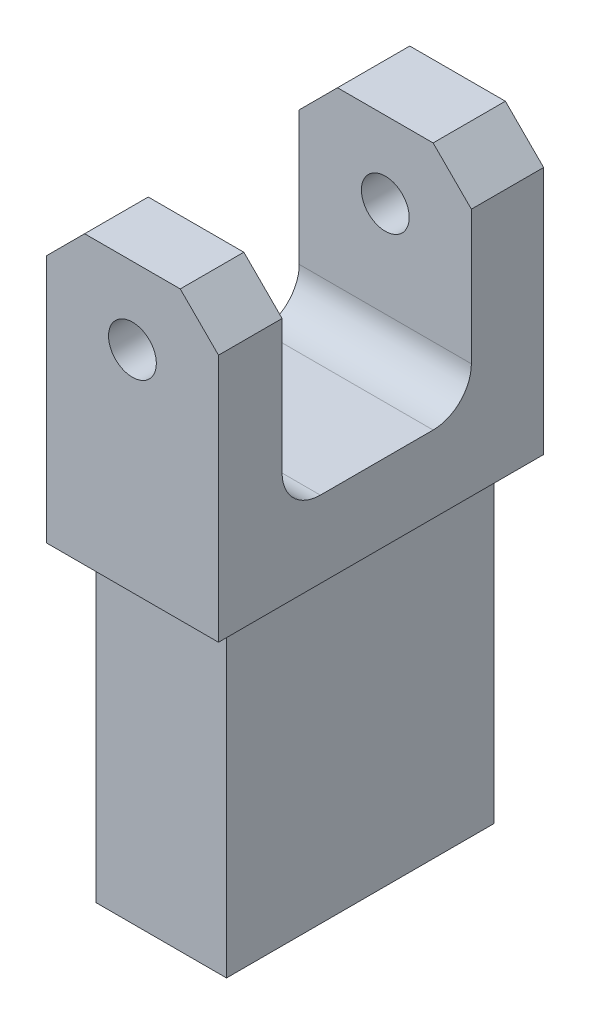
ISO-10303-21;
HEADER;
FILE_DESCRIPTION(('STEP AP214'),'2;1');
FILE_NAME('part.step','',(''),(''),'','','');
FILE_SCHEMA(('AUTOMOTIVE_DESIGN { 1 0 10303 214 1 1 1 1 }'));
ENDSEC;
DATA;
#1=APPLICATION_CONTEXT('core data for automotive mechanical design processes');
#2=APPLICATION_PROTOCOL_DEFINITION('international standard','automotive_design',2000,#1);
#3=PRODUCT_CONTEXT('',#1,'mechanical');
#4=PRODUCT('Part','Part','',(#3));
#5=PRODUCT_RELATED_PRODUCT_CATEGORY('part','',(#4));
#6=PRODUCT_DEFINITION_FORMATION('','',#4);
#7=PRODUCT_DEFINITION_CONTEXT('part definition',#1,'design');
#8=PRODUCT_DEFINITION('design','',#6,#7);
#9=PRODUCT_DEFINITION_SHAPE('','',#8);
#10=(LENGTH_UNIT() NAMED_UNIT(*) SI_UNIT(.MILLI.,.METRE.));
#11=(NAMED_UNIT(*) PLANE_ANGLE_UNIT() SI_UNIT($,.RADIAN.));
#12=(NAMED_UNIT(*) SI_UNIT($,.STERADIAN.) SOLID_ANGLE_UNIT());
#13=UNCERTAINTY_MEASURE_WITH_UNIT(LENGTH_MEASURE(1.E-05),#10,'distance_accuracy_value','');
#14=(GEOMETRIC_REPRESENTATION_CONTEXT(3) GLOBAL_UNCERTAINTY_ASSIGNED_CONTEXT((#13)) GLOBAL_UNIT_ASSIGNED_CONTEXT((#10,
#11,#12)) REPRESENTATION_CONTEXT('',''));
#15=CARTESIAN_POINT('',(0.,0.,0.));
#16=DIRECTION('',(0.,0.,1.));
#17=DIRECTION('',(1.,0.,0.));
#18=AXIS2_PLACEMENT_3D('',#15,#16,#17);
#19=CARTESIAN_POINT('',(-0.577831778362566,45.,19.6101717655523));
#20=DIRECTION('',(0.,1.,0.));
#21=DIRECTION('',(0.,0.,1.));
#22=AXIS2_PLACEMENT_3D('',#19,#20,#21);
#23=PLANE('',#22);
#24=DIRECTION('',(-1.,0.,0.));
#25=VECTOR('',#24,1.);
#26=CARTESIAN_POINT('',(-0.577831778362566,45.,27.1665188383849));
#27=LINE('',#26,#25);
#28=CARTESIAN_POINT('',(13.4221682216374,45.,27.1665188383849));
#29=VERTEX_POINT('',#28);
#30=CARTESIAN_POINT('',(3.42216822163744,45.,27.1665188383849));
#31=VERTEX_POINT('',#30);
#32=EDGE_CURVE('E233',#29,#31,#27,.T.);
#33=ORIENTED_EDGE('',*,*,#32,.F.);
#34=DIRECTION('',(0.,0.,-1.));
#35=VECTOR('',#34,1.);
#36=CARTESIAN_POINT('',(13.4221682216374,45.,19.6101717655523));
#37=LINE('',#36,#35);
#38=CARTESIAN_POINT('',(13.4221682216374,45.,19.6101717655523));
#39=VERTEX_POINT('',#38);
#40=EDGE_CURVE('E283',#29,#39,#37,.T.);
#41=ORIENTED_EDGE('',*,*,#40,.T.);
#42=DIRECTION('',(-1.,0.,0.));
#43=VECTOR('',#42,1.);
#44=CARTESIAN_POINT('',(17.4221682216374,45.,19.6101717655523));
#45=LINE('',#44,#43);
#46=CARTESIAN_POINT('',(3.42216822163743,45.,19.6101717655523));
#47=VERTEX_POINT('',#46);
#48=EDGE_CURVE('E187',#39,#47,#45,.T.);
#49=ORIENTED_EDGE('',*,*,#48,.T.);
#50=DIRECTION('',(0.,0.,1.));
#51=VECTOR('',#50,1.);
#52=CARTESIAN_POINT('',(3.42216822163744,45.,27.1665188383849));
#53=LINE('',#52,#51);
#54=EDGE_CURVE('E280',#47,#31,#53,.T.);
#55=ORIENTED_EDGE('',*,*,#54,.T.);
#56=EDGE_LOOP('',(#33,#41,#49,#55));
#57=FACE_BOUND('',#56,.T.);
#58=ADVANCED_FACE('F32',(#57),#23,.T.);
#59=CARTESIAN_POINT('',(1.59801074958471,15.,22.624129945896));
#60=DIRECTION('',(1.,0.,0.));
#61=DIRECTION('',(0.,0.,-1.));
#62=AXIS2_PLACEMENT_3D('',#59,#60,#61);
#63=PLANE('',#62);
#64=DIRECTION('',(0.,0.,1.));
#65=VECTOR('',#64,1.);
#66=CARTESIAN_POINT('',(1.59801074958471,-18.,22.624129945896));
#67=LINE('',#66,#65);
#68=CARTESIAN_POINT('',(1.59801074958471,-18.,22.624129945896));
#69=VERTEX_POINT('',#68);
#70=CARTESIAN_POINT('',(1.59801074958471,-18.,50.5962135852226));
#71=VERTEX_POINT('',#70);
#72=EDGE_CURVE('E166',#69,#71,#67,.T.);
#73=ORIENTED_EDGE('',*,*,#72,.T.);
#74=DIRECTION('',(0.,-1.,0.));
#75=VECTOR('',#74,1.);
#76=CARTESIAN_POINT('',(1.59801074958471,15.,50.5962135852226));
#77=LINE('',#76,#75);
#78=CARTESIAN_POINT('',(1.59801074958471,15.,50.5962135852226));
#79=VERTEX_POINT('',#78);
#80=EDGE_CURVE('E227',#79,#71,#77,.T.);
#81=ORIENTED_EDGE('',*,*,#80,.F.);
#82=DIRECTION('',(0.,0.,1.));
#83=VECTOR('',#82,1.);
#84=CARTESIAN_POINT('',(1.59801074958471,15.,22.624129945896));
#85=LINE('',#84,#83);
#86=CARTESIAN_POINT('',(1.59801074958471,15.,22.624129945896));
#87=VERTEX_POINT('',#86);
#88=EDGE_CURVE('E198',#87,#79,#85,.T.);
#89=ORIENTED_EDGE('',*,*,#88,.F.);
#90=DIRECTION('',(0.,-1.,0.));
#91=VECTOR('',#90,1.);
#92=CARTESIAN_POINT('',(1.59801074958471,15.,22.624129945896));
#93=LINE('',#92,#91);
#94=EDGE_CURVE('E211',#87,#69,#93,.T.);
#95=ORIENTED_EDGE('',*,*,#94,.T.);
#96=EDGE_LOOP('',(#73,#81,#89,#95));
#97=FACE_BOUND('',#96,.T.);
#98=ADVANCED_FACE('F320',(#97),#63,.F.);
#99=CARTESIAN_POINT('',(1.59801074958471,15.,50.5962135852226));
#100=DIRECTION('',(0.,0.,-1.));
#101=DIRECTION('',(-1.,0.,0.));
#102=AXIS2_PLACEMENT_3D('',#99,#100,#101);
#103=PLANE('',#102);
#104=DIRECTION('',(1.,0.,0.));
#105=VECTOR('',#104,1.);
#106=CARTESIAN_POINT('',(1.59801074958471,-18.,50.5962135852226));
#107=LINE('',#106,#105);
#108=CARTESIAN_POINT('',(15.2463256936804,-18.,50.5962135852226));
#109=VERTEX_POINT('',#108);
#110=EDGE_CURVE('E214',#71,#109,#107,.T.);
#111=ORIENTED_EDGE('',*,*,#110,.T.);
#112=DIRECTION('',(0.,-1.,0.));
#113=VECTOR('',#112,1.);
#114=CARTESIAN_POINT('',(15.2463256936804,15.,50.5962135852226));
#115=LINE('',#114,#113);
#116=CARTESIAN_POINT('',(15.2463256936804,15.,50.5962135852226));
#117=VERTEX_POINT('',#116);
#118=EDGE_CURVE('E224',#117,#109,#115,.T.);
#119=ORIENTED_EDGE('',*,*,#118,.F.);
#120=DIRECTION('',(1.,0.,0.));
#121=VECTOR('',#120,1.);
#122=CARTESIAN_POINT('',(1.59801074958471,15.,50.5962135852226));
#123=LINE('',#122,#121);
#124=EDGE_CURVE('E201',#79,#117,#123,.T.);
#125=ORIENTED_EDGE('',*,*,#124,.F.);
#126=ORIENTED_EDGE('',*,*,#80,.T.);
#127=EDGE_LOOP('',(#111,#119,#125,#126));
#128=FACE_BOUND('',#127,.T.);
#129=ADVANCED_FACE('F326',(#128),#103,.F.);
#130=CARTESIAN_POINT('',(15.2463256936804,15.,22.624129945896));
#131=DIRECTION('',(-1.,0.,0.));
#132=DIRECTION('',(0.,0.,1.));
#133=AXIS2_PLACEMENT_3D('',#130,#131,#132);
#134=PLANE('',#133);
#135=DIRECTION('',(0.,0.,-1.));
#136=VECTOR('',#135,1.);
#137=CARTESIAN_POINT('',(15.2463256936804,-18.,22.624129945896));
#138=LINE('',#137,#136);
#139=CARTESIAN_POINT('',(15.2463256936804,-18.,22.624129945896));
#140=VERTEX_POINT('',#139);
#141=EDGE_CURVE('E216',#109,#140,#138,.T.);
#142=ORIENTED_EDGE('',*,*,#141,.T.);
#143=DIRECTION('',(0.,-1.,0.));
#144=VECTOR('',#143,1.);
#145=CARTESIAN_POINT('',(15.2463256936804,15.,22.624129945896));
#146=LINE('',#145,#144);
#147=CARTESIAN_POINT('',(15.2463256936804,15.,22.624129945896));
#148=VERTEX_POINT('',#147);
#149=EDGE_CURVE('E221',#148,#140,#146,.T.);
#150=ORIENTED_EDGE('',*,*,#149,.F.);
#151=DIRECTION('',(0.,0.,-1.));
#152=VECTOR('',#151,1.);
#153=CARTESIAN_POINT('',(15.2463256936804,15.,22.624129945896));
#154=LINE('',#153,#152);
#155=EDGE_CURVE('E205',#117,#148,#154,.T.);
#156=ORIENTED_EDGE('',*,*,#155,.F.);
#157=ORIENTED_EDGE('',*,*,#118,.T.);
#158=EDGE_LOOP('',(#142,#150,#156,#157));
#159=FACE_BOUND('',#158,.T.);
#160=ADVANCED_FACE('F512',(#159),#134,.F.);
#161=CARTESIAN_POINT('',(1.59801074958471,15.,22.624129945896));
#162=DIRECTION('',(0.,0.,1.));
#163=DIRECTION('',(1.,0.,0.));
#164=AXIS2_PLACEMENT_3D('',#161,#162,#163);
#165=PLANE('',#164);
#166=DIRECTION('',(-1.,0.,0.));
#167=VECTOR('',#166,1.);
#168=CARTESIAN_POINT('',(1.59801074958471,-18.,22.624129945896));
#169=LINE('',#168,#167);
#170=EDGE_CURVE('E202',#140,#69,#169,.T.);
#171=ORIENTED_EDGE('',*,*,#170,.T.);
#172=ORIENTED_EDGE('',*,*,#94,.F.);
#173=DIRECTION('',(-1.,0.,0.));
#174=VECTOR('',#173,1.);
#175=CARTESIAN_POINT('',(1.59801074958471,15.,22.624129945896));
#176=LINE('',#175,#174);
#177=EDGE_CURVE('E208',#148,#87,#176,.T.);
#178=ORIENTED_EDGE('',*,*,#177,.F.);
#179=ORIENTED_EDGE('',*,*,#149,.T.);
#180=EDGE_LOOP('',(#171,#172,#178,#179));
#181=FACE_BOUND('',#180,.T.);
#182=ADVANCED_FACE('F503',(#181),#165,.F.);
#183=CARTESIAN_POINT('',(1.59801074958471,-18.,50.5962135852226));
#184=DIRECTION('',(0.,1.,0.));
#185=DIRECTION('',(0.,0.,1.));
#186=AXIS2_PLACEMENT_3D('',#183,#184,#185);
#187=PLANE('',#186);
#188=ORIENTED_EDGE('',*,*,#72,.F.);
#189=ORIENTED_EDGE('',*,*,#170,.F.);
#190=ORIENTED_EDGE('',*,*,#141,.F.);
#191=ORIENTED_EDGE('',*,*,#110,.F.);
#192=EDGE_LOOP('',(#188,#189,#190,#191));
#193=FACE_BOUND('',#192,.T.);
#194=ADVANCED_FACE('F495',(#193),#187,.F.);
#195=CARTESIAN_POINT('',(-0.577831778362566,15.,19.6101717655523));
#196=DIRECTION('',(0.,1.,0.));
#197=DIRECTION('',(0.,0.,1.));
#198=AXIS2_PLACEMENT_3D('',#195,#196,#197);
#199=PLANE('',#198);
#200=DIRECTION('',(0.,0.,1.));
#201=VECTOR('',#200,1.);
#202=CARTESIAN_POINT('',(-0.577831778362568,15.,53.6101717655523));
#203=LINE('',#202,#201);
#204=CARTESIAN_POINT('',(-0.577831778362568,15.,19.6101717655523));
#205=VERTEX_POINT('',#204);
#206=CARTESIAN_POINT('',(-0.577831778362568,15.,53.6101717655523));
#207=VERTEX_POINT('',#206);
#208=EDGE_CURVE('E174',#205,#207,#203,.T.);
#209=ORIENTED_EDGE('',*,*,#208,.F.);
#210=DIRECTION('',(-1.,0.,0.));
#211=VECTOR('',#210,1.);
#212=CARTESIAN_POINT('',(17.4221682216374,15.,19.6101717655523));
#213=LINE('',#212,#211);
#214=CARTESIAN_POINT('',(17.4221682216374,15.,19.6101717655523));
#215=VERTEX_POINT('',#214);
#216=EDGE_CURVE('E191',#215,#205,#213,.T.);
#217=ORIENTED_EDGE('',*,*,#216,.F.);
#218=DIRECTION('',(0.,0.,-1.));
#219=VECTOR('',#218,1.);
#220=CARTESIAN_POINT('',(17.4221682216374,15.,53.6101717655523));
#221=LINE('',#220,#219);
#222=CARTESIAN_POINT('',(17.4221682216374,15.,53.6101717655523));
#223=VERTEX_POINT('',#222);
#224=EDGE_CURVE('E176',#223,#215,#221,.T.);
#225=ORIENTED_EDGE('',*,*,#224,.F.);
#226=DIRECTION('',(1.,0.,0.));
#227=VECTOR('',#226,1.);
#228=CARTESIAN_POINT('',(17.4221682216374,15.,53.6101717655523));
#229=LINE('',#228,#227);
#230=EDGE_CURVE('E160',#207,#223,#229,.T.);
#231=ORIENTED_EDGE('',*,*,#230,.F.);
#232=EDGE_LOOP('',(#209,#217,#225,#231));
#233=FACE_BOUND('',#232,.T.);
#234=ORIENTED_EDGE('',*,*,#177,.T.);
#235=ORIENTED_EDGE('',*,*,#88,.T.);
#236=ORIENTED_EDGE('',*,*,#124,.T.);
#237=ORIENTED_EDGE('',*,*,#155,.T.);
#238=EDGE_LOOP('',(#234,#235,#236,#237));
#239=FACE_BOUND('',#238,.T.);
#240=ADVANCED_FACE('F171',(#233,#239),#199,.F.);
#241=CARTESIAN_POINT('',(-0.577831778362568,45.,53.6101717655523));
#242=DIRECTION('',(1.,0.,0.));
#243=DIRECTION('',(0.,0.,-1.));
#244=AXIS2_PLACEMENT_3D('',#241,#242,#243);
#245=PLANE('',#244);
#246=DIRECTION('',(0.,-1.,0.));
#247=VECTOR('',#246,1.);
#248=CARTESIAN_POINT('',(-0.577831778362568,45.,53.6101717655523));
#249=LINE('',#248,#247);
#250=CARTESIAN_POINT('',(-0.577831778362568,41.,53.6101717655523));
#251=VERTEX_POINT('',#250);
#252=EDGE_CURVE('E156',#251,#207,#249,.T.);
#253=ORIENTED_EDGE('',*,*,#252,.F.);
#254=DIRECTION('',(0.,0.,-1.));
#255=VECTOR('',#254,1.);
#256=CARTESIAN_POINT('',(-0.577831778362568,41.,46.9592331897388));
#257=LINE('',#256,#255);
#258=CARTESIAN_POINT('',(-0.577831778362568,41.,46.9592331897388));
#259=VERTEX_POINT('',#258);
#260=EDGE_CURVE('E11',#251,#259,#257,.T.);
#261=ORIENTED_EDGE('',*,*,#260,.T.);
#262=DIRECTION('',(0.,-1.,0.));
#263=VECTOR('',#262,1.);
#264=CARTESIAN_POINT('',(-0.577831778362568,45.,46.9592331897388));
#265=LINE('',#264,#263);
#266=CARTESIAN_POINT('',(-0.577831778362568,27.,46.9592331897388));
#267=VERTEX_POINT('',#266);
#268=EDGE_CURVE('E355',#259,#267,#265,.T.);
#269=ORIENTED_EDGE('',*,*,#268,.T.);
#270=CARTESIAN_POINT('',(-0.577831778362568,27.,42.9592331897388));
#271=DIRECTION('',(1.,0.,0.));
#272=DIRECTION('',(0.,0.,-1.));
#273=AXIS2_PLACEMENT_3D('',#270,#271,#272);
#274=CIRCLE('',#273,4.);
#275=CARTESIAN_POINT('',(-0.577831778362568,23.,42.9592331897388));
#276=VERTEX_POINT('',#275);
#277=EDGE_CURVE('E256',#267,#276,#274,.T.);
#278=ORIENTED_EDGE('',*,*,#277,.T.);
#279=DIRECTION('',(0.,0.,-1.));
#280=VECTOR('',#279,1.);
#281=CARTESIAN_POINT('',(-0.577831778362568,23.,53.6101717655523));
#282=LINE('',#281,#280);
#283=CARTESIAN_POINT('',(-0.577831778362568,23.,31.1665188383849));
#284=VERTEX_POINT('',#283);
#285=EDGE_CURVE('E181',#276,#284,#282,.T.);
#286=ORIENTED_EDGE('',*,*,#285,.T.);
#287=CARTESIAN_POINT('',(-0.577831778362568,27.,31.1665188383849));
#288=DIRECTION('',(1.,0.,0.));
#289=DIRECTION('',(0.,0.,-1.));
#290=AXIS2_PLACEMENT_3D('',#287,#288,#289);
#291=CIRCLE('',#290,4.);
#292=CARTESIAN_POINT('',(-0.577831778362568,27.,27.1665188383849));
#293=VERTEX_POINT('',#292);
#294=EDGE_CURVE('E250',#284,#293,#291,.T.);
#295=ORIENTED_EDGE('',*,*,#294,.T.);
#296=DIRECTION('',(0.,1.,0.));
#297=VECTOR('',#296,1.);
#298=CARTESIAN_POINT('',(-0.577831778362568,45.,27.1665188383849));
#299=LINE('',#298,#297);
#300=CARTESIAN_POINT('',(-0.577831778362568,41.,27.1665188383849));
#301=VERTEX_POINT('',#300);
#302=EDGE_CURVE('E184',#293,#301,#299,.T.);
#303=ORIENTED_EDGE('',*,*,#302,.T.);
#304=DIRECTION('',(0.,0.,-1.));
#305=VECTOR('',#304,1.);
#306=CARTESIAN_POINT('',(-0.577831778362568,41.,19.6101717655523));
#307=LINE('',#306,#305);
#308=CARTESIAN_POINT('',(-0.577831778362568,41.,19.6101717655523));
#309=VERTEX_POINT('',#308);
#310=EDGE_CURVE('E40',#301,#309,#307,.T.);
#311=ORIENTED_EDGE('',*,*,#310,.T.);
#312=DIRECTION('',(0.,-1.,0.));
#313=VECTOR('',#312,1.);
#314=CARTESIAN_POINT('',(-0.577831778362568,45.,19.6101717655523));
#315=LINE('',#314,#313);
#316=EDGE_CURVE('E179',#309,#205,#315,.T.);
#317=ORIENTED_EDGE('',*,*,#316,.T.);
#318=ORIENTED_EDGE('',*,*,#208,.T.);
#319=EDGE_LOOP('',(#253,#261,#269,#278,#286,#295,#303,#311,#317,#318));
#320=FACE_BOUND('',#319,.T.);
#321=ADVANCED_FACE('F178',(#320),#245,.F.);
#322=CARTESIAN_POINT('',(17.4221682216374,45.,53.6101717655523));
#323=DIRECTION('',(0.,0.,-1.));
#324=DIRECTION('',(-1.,0.,0.));
#325=AXIS2_PLACEMENT_3D('',#322,#323,#324);
#326=PLANE('',#325);
#327=CARTESIAN_POINT('',(8.42216822163744,37.,53.6101717655523));
#328=DIRECTION('',(0.,0.,1.));
#329=DIRECTION('',(1.,0.,0.));
#330=AXIS2_PLACEMENT_3D('',#327,#328,#329);
#331=CIRCLE('',#330,2.5);
#332=CARTESIAN_POINT('',(10.9221682216374,37.,53.6101717655523));
#333=VERTEX_POINT('',#332);
#334=EDGE_CURVE('E554',#333,#333,#331,.T.);
#335=ORIENTED_EDGE('',*,*,#334,.F.);
#336=EDGE_LOOP('',(#335));
#337=FACE_BOUND('',#336,.T.);
#338=DIRECTION('',(0.,-1.,0.));
#339=VECTOR('',#338,1.);
#340=CARTESIAN_POINT('',(17.4221682216374,45.,53.6101717655523));
#341=LINE('',#340,#339);
#342=CARTESIAN_POINT('',(17.4221682216374,41.,53.6101717655523));
#343=VERTEX_POINT('',#342);
#344=EDGE_CURVE('E167',#343,#223,#341,.T.);
#345=ORIENTED_EDGE('',*,*,#344,.F.);
#346=DIRECTION('',(-0.707106781186546,0.707106781186549,0.));
#347=VECTOR('',#346,1.);
#348=CARTESIAN_POINT('',(13.4221682216374,45.,53.6101717655523));
#349=LINE('',#348,#347);
#350=CARTESIAN_POINT('',(13.4221682216374,45.,53.6101717655523));
#351=VERTEX_POINT('',#350);
#352=EDGE_CURVE('E278',#343,#351,#349,.T.);
#353=ORIENTED_EDGE('',*,*,#352,.T.);
#354=DIRECTION('',(1.,0.,0.));
#355=VECTOR('',#354,1.);
#356=CARTESIAN_POINT('',(17.4221682216374,45.,53.6101717655523));
#357=LINE('',#356,#355);
#358=CARTESIAN_POINT('',(3.42216822163743,45.,53.6101717655523));
#359=VERTEX_POINT('',#358);
#360=EDGE_CURVE('E193',#359,#351,#357,.T.);
#361=ORIENTED_EDGE('',*,*,#360,.F.);
#362=DIRECTION('',(-0.707106781186547,-0.707106781186548,0.));
#363=VECTOR('',#362,1.);
#364=CARTESIAN_POINT('',(3.42216822163744,45.,53.6101717655523));
#365=LINE('',#364,#363);
#366=EDGE_CURVE('E163',#359,#251,#365,.T.);
#367=ORIENTED_EDGE('',*,*,#366,.T.);
#368=ORIENTED_EDGE('',*,*,#252,.T.);
#369=ORIENTED_EDGE('',*,*,#230,.T.);
#370=EDGE_LOOP('',(#345,#353,#361,#367,#368,#369));
#371=FACE_BOUND('',#370,.T.);
#372=ADVANCED_FACE('F159',(#337,#371),#326,.F.);
#373=CARTESIAN_POINT('',(17.4221682216374,45.,53.6101717655523));
#374=DIRECTION('',(-1.,0.,0.));
#375=DIRECTION('',(0.,0.,1.));
#376=AXIS2_PLACEMENT_3D('',#373,#374,#375);
#377=PLANE('',#376);
#378=DIRECTION('',(0.,1.,0.));
#379=VECTOR('',#378,1.);
#380=CARTESIAN_POINT('',(17.4221682216374,45.,46.9592331897388));
#381=LINE('',#380,#379);
#382=CARTESIAN_POINT('',(17.4221682216374,27.,46.9592331897388));
#383=VERTEX_POINT('',#382);
#384=CARTESIAN_POINT('',(17.4221682216374,41.,46.9592331897388));
#385=VERTEX_POINT('',#384);
#386=EDGE_CURVE('E353',#383,#385,#381,.T.);
#387=ORIENTED_EDGE('',*,*,#386,.T.);
#388=DIRECTION('',(0.,0.,1.));
#389=VECTOR('',#388,1.);
#390=CARTESIAN_POINT('',(17.4221682216374,41.,53.6101717655523));
#391=LINE('',#390,#389);
#392=EDGE_CURVE('E275',#385,#343,#391,.T.);
#393=ORIENTED_EDGE('',*,*,#392,.T.);
#394=ORIENTED_EDGE('',*,*,#344,.T.);
#395=ORIENTED_EDGE('',*,*,#224,.T.);
#396=DIRECTION('',(0.,-1.,0.));
#397=VECTOR('',#396,1.);
#398=CARTESIAN_POINT('',(17.4221682216374,45.,19.6101717655523));
#399=LINE('',#398,#397);
#400=CARTESIAN_POINT('',(17.4221682216374,41.,19.6101717655523));
#401=VERTEX_POINT('',#400);
#402=EDGE_CURVE('E195',#401,#215,#399,.T.);
#403=ORIENTED_EDGE('',*,*,#402,.F.);
#404=DIRECTION('',(0.,0.,1.));
#405=VECTOR('',#404,1.);
#406=CARTESIAN_POINT('',(17.4221682216374,41.,27.1665188383849));
#407=LINE('',#406,#405);
#408=CARTESIAN_POINT('',(17.4221682216374,41.,27.1665188383849));
#409=VERTEX_POINT('',#408);
#410=EDGE_CURVE('E273',#401,#409,#407,.T.);
#411=ORIENTED_EDGE('',*,*,#410,.T.);
#412=DIRECTION('',(0.,-1.,0.));
#413=VECTOR('',#412,1.);
#414=CARTESIAN_POINT('',(17.4221682216374,45.,27.1665188383849));
#415=LINE('',#414,#413);
#416=CARTESIAN_POINT('',(17.4221682216374,27.,27.1665188383849));
#417=VERTEX_POINT('',#416);
#418=EDGE_CURVE('E296',#409,#417,#415,.T.);
#419=ORIENTED_EDGE('',*,*,#418,.T.);
#420=CARTESIAN_POINT('',(17.4221682216374,27.,31.1665188383849));
#421=DIRECTION('',(-1.,0.,0.));
#422=DIRECTION('',(0.,0.,1.));
#423=AXIS2_PLACEMENT_3D('',#420,#421,#422);
#424=CIRCLE('',#423,4.);
#425=CARTESIAN_POINT('',(17.4221682216374,23.,31.1665188383849));
#426=VERTEX_POINT('',#425);
#427=EDGE_CURVE('E252',#417,#426,#424,.T.);
#428=ORIENTED_EDGE('',*,*,#427,.T.);
#429=DIRECTION('',(0.,0.,1.));
#430=VECTOR('',#429,1.);
#431=CARTESIAN_POINT('',(17.4221682216374,23.,53.6101717655523));
#432=LINE('',#431,#430);
#433=CARTESIAN_POINT('',(17.4221682216374,23.,42.9592331897388));
#434=VERTEX_POINT('',#433);
#435=EDGE_CURVE('E235',#426,#434,#432,.T.);
#436=ORIENTED_EDGE('',*,*,#435,.T.);
#437=CARTESIAN_POINT('',(17.4221682216374,27.,42.9592331897388));
#438=DIRECTION('',(-1.,0.,0.));
#439=DIRECTION('',(0.,0.,1.));
#440=AXIS2_PLACEMENT_3D('',#437,#438,#439);
#441=CIRCLE('',#440,4.);
#442=EDGE_CURVE('E254',#434,#383,#441,.T.);
#443=ORIENTED_EDGE('',*,*,#442,.T.);
#444=EDGE_LOOP('',(#387,#393,#394,#395,#403,#411,#419,#428,#436,#443));
#445=FACE_BOUND('',#444,.T.);
#446=ADVANCED_FACE('F310',(#445),#377,.F.);
#447=CARTESIAN_POINT('',(17.4221682216374,45.,19.6101717655523));
#448=DIRECTION('',(0.,0.,1.));
#449=DIRECTION('',(1.,0.,0.));
#450=AXIS2_PLACEMENT_3D('',#447,#448,#449);
#451=PLANE('',#450);
#452=CARTESIAN_POINT('',(8.42216822163744,37.,19.6101717655523));
#453=DIRECTION('',(0.,0.,1.));
#454=DIRECTION('',(1.,0.,0.));
#455=AXIS2_PLACEMENT_3D('',#452,#453,#454);
#456=CIRCLE('',#455,2.5);
#457=CARTESIAN_POINT('',(10.9221682216374,37.,19.6101717655523));
#458=VERTEX_POINT('',#457);
#459=EDGE_CURVE('E263',#458,#458,#456,.T.);
#460=ORIENTED_EDGE('',*,*,#459,.T.);
#461=EDGE_LOOP('',(#460));
#462=FACE_BOUND('',#461,.T.);
#463=ORIENTED_EDGE('',*,*,#48,.F.);
#464=DIRECTION('',(0.707106781186546,-0.707106781186549,0.));
#465=VECTOR('',#464,1.);
#466=CARTESIAN_POINT('',(13.4221682216374,45.,19.6101717655523));
#467=LINE('',#466,#465);
#468=EDGE_CURVE('E288',#39,#401,#467,.T.);
#469=ORIENTED_EDGE('',*,*,#468,.T.);
#470=ORIENTED_EDGE('',*,*,#402,.T.);
#471=ORIENTED_EDGE('',*,*,#216,.T.);
#472=ORIENTED_EDGE('',*,*,#316,.F.);
#473=DIRECTION('',(0.707106781186547,0.707106781186548,0.));
#474=VECTOR('',#473,1.);
#475=CARTESIAN_POINT('',(3.42216822163744,45.,19.6101717655523));
#476=LINE('',#475,#474);
#477=EDGE_CURVE('E286',#309,#47,#476,.T.);
#478=ORIENTED_EDGE('',*,*,#477,.T.);
#479=EDGE_LOOP('',(#463,#469,#470,#471,#472,#478));
#480=FACE_BOUND('',#479,.T.);
#481=ADVANCED_FACE('F307',(#462,#480),#451,.F.);
#482=ORIENTED_EDGE('',*,*,#360,.T.);
#483=DIRECTION('',(0.,0.,-1.));
#484=VECTOR('',#483,1.);
#485=CARTESIAN_POINT('',(13.4221682216374,45.,46.9592331897388));
#486=LINE('',#485,#484);
#487=CARTESIAN_POINT('',(13.4221682216374,45.,46.9592331897388));
#488=VERTEX_POINT('',#487);
#489=EDGE_CURVE('E266',#351,#488,#486,.T.);
#490=ORIENTED_EDGE('',*,*,#489,.T.);
#491=DIRECTION('',(1.,0.,0.));
#492=VECTOR('',#491,1.);
#493=CARTESIAN_POINT('',(-0.577831778362566,45.,46.9592331897388));
#494=LINE('',#493,#492);
#495=CARTESIAN_POINT('',(3.42216822163744,45.,46.9592331897388));
#496=VERTEX_POINT('',#495);
#497=EDGE_CURVE('E230',#496,#488,#494,.T.);
#498=ORIENTED_EDGE('',*,*,#497,.F.);
#499=DIRECTION('',(0.,0.,1.));
#500=VECTOR('',#499,1.);
#501=CARTESIAN_POINT('',(3.42216822163744,45.,53.6101717655523));
#502=LINE('',#501,#500);
#503=EDGE_CURVE('E258',#496,#359,#502,.T.);
#504=ORIENTED_EDGE('',*,*,#503,.T.);
#505=EDGE_LOOP('',(#482,#490,#498,#504));
#506=FACE_BOUND('',#505,.T.);
#507=ADVANCED_FACE('F322',(#506),#23,.T.);
#508=CARTESIAN_POINT('',(-1.3474044098595,23.,27.1665188383849));
#509=DIRECTION('',(0.,-1.,0.));
#510=DIRECTION('',(0.,0.,-1.));
#511=AXIS2_PLACEMENT_3D('',#508,#509,#510);
#512=PLANE('',#511);
#513=ORIENTED_EDGE('',*,*,#435,.F.);
#514=DIRECTION('',(-1.,0.,0.));
#515=VECTOR('',#514,1.);
#516=CARTESIAN_POINT('',(-0.577831778362568,23.,31.1665188383849));
#517=LINE('',#516,#515);
#518=EDGE_CURVE('E241',#426,#284,#517,.T.);
#519=ORIENTED_EDGE('',*,*,#518,.T.);
#520=ORIENTED_EDGE('',*,*,#285,.F.);
#521=DIRECTION('',(1.,0.,0.));
#522=VECTOR('',#521,1.);
#523=CARTESIAN_POINT('',(17.4221682216374,23.,42.9592331897388));
#524=LINE('',#523,#522);
#525=EDGE_CURVE('E238',#276,#434,#524,.T.);
#526=ORIENTED_EDGE('',*,*,#525,.T.);
#527=EDGE_LOOP('',(#513,#519,#520,#526));
#528=FACE_BOUND('',#527,.T.);
#529=ADVANCED_FACE('F332',(#528),#512,.F.);
#530=CARTESIAN_POINT('',(-1.3474044098595,23.,27.1665188383849));
#531=DIRECTION('',(0.,0.,-1.));
#532=DIRECTION('',(-1.,0.,0.));
#533=AXIS2_PLACEMENT_3D('',#530,#531,#532);
#534=PLANE('',#533);
#535=CARTESIAN_POINT('',(8.42216822163744,37.,27.1665188383849));
#536=DIRECTION('',(0.,0.,-1.));
#537=DIRECTION('',(-1.,0.,0.));
#538=AXIS2_PLACEMENT_3D('',#535,#536,#537);
#539=CIRCLE('',#538,2.5);
#540=CARTESIAN_POINT('',(5.92216822163744,37.,27.1665188383849));
#541=VERTEX_POINT('',#540);
#542=EDGE_CURVE('E262',#541,#541,#539,.T.);
#543=ORIENTED_EDGE('',*,*,#542,.T.);
#544=EDGE_LOOP('',(#543));
#545=FACE_BOUND('',#544,.T.);
#546=ORIENTED_EDGE('',*,*,#418,.F.);
#547=DIRECTION('',(-0.707106781186546,0.707106781186549,0.));
#548=VECTOR('',#547,1.);
#549=CARTESIAN_POINT('',(13.4221682216374,45.,27.1665188383849));
#550=LINE('',#549,#548);
#551=EDGE_CURVE('E291',#409,#29,#550,.T.);
#552=ORIENTED_EDGE('',*,*,#551,.T.);
#553=ORIENTED_EDGE('',*,*,#32,.T.);
#554=DIRECTION('',(-0.707106781186547,-0.707106781186548,0.));
#555=VECTOR('',#554,1.);
#556=CARTESIAN_POINT('',(3.42216822163744,45.,27.1665188383849));
#557=LINE('',#556,#555);
#558=EDGE_CURVE('E47',#31,#301,#557,.T.);
#559=ORIENTED_EDGE('',*,*,#558,.T.);
#560=ORIENTED_EDGE('',*,*,#302,.F.);
#561=DIRECTION('',(-1.,0.,0.));
#562=VECTOR('',#561,1.);
#563=CARTESIAN_POINT('',(17.4221682216374,27.,27.1665188383849));
#564=LINE('',#563,#562);
#565=EDGE_CURVE('E244',#293,#417,#564,.F.);
#566=ORIENTED_EDGE('',*,*,#565,.T.);
#567=EDGE_LOOP('',(#546,#552,#553,#559,#560,#566));
#568=FACE_BOUND('',#567,.T.);
#569=ADVANCED_FACE('F295',(#545,#568),#534,.F.);
#570=CARTESIAN_POINT('',(-1.3474044098595,23.,46.9592331897388));
#571=DIRECTION('',(0.,0.,1.));
#572=DIRECTION('',(1.,0.,0.));
#573=AXIS2_PLACEMENT_3D('',#570,#571,#572);
#574=PLANE('',#573);
#575=CARTESIAN_POINT('',(8.42216822163744,37.,46.9592331897388));
#576=DIRECTION('',(0.,0.,1.));
#577=DIRECTION('',(1.,0.,0.));
#578=AXIS2_PLACEMENT_3D('',#575,#576,#577);
#579=CIRCLE('',#578,2.5);
#580=CARTESIAN_POINT('',(10.9221682216374,37.,46.9592331897388));
#581=VERTEX_POINT('',#580);
#582=EDGE_CURVE('E259',#581,#581,#579,.T.);
#583=ORIENTED_EDGE('',*,*,#582,.T.);
#584=EDGE_LOOP('',(#583));
#585=FACE_BOUND('',#584,.T.);
#586=ORIENTED_EDGE('',*,*,#497,.T.);
#587=DIRECTION('',(0.707106781186546,-0.707106781186549,0.));
#588=VECTOR('',#587,1.);
#589=CARTESIAN_POINT('',(13.4221682216374,45.,46.9592331897388));
#590=LINE('',#589,#588);
#591=EDGE_CURVE('E271',#488,#385,#590,.T.);
#592=ORIENTED_EDGE('',*,*,#591,.T.);
#593=ORIENTED_EDGE('',*,*,#386,.F.);
#594=DIRECTION('',(1.,0.,0.));
#595=VECTOR('',#594,1.);
#596=CARTESIAN_POINT('',(-0.577831778362568,27.,46.9592331897388));
#597=LINE('',#596,#595);
#598=EDGE_CURVE('E247',#383,#267,#597,.F.);
#599=ORIENTED_EDGE('',*,*,#598,.T.);
#600=ORIENTED_EDGE('',*,*,#268,.F.);
#601=DIRECTION('',(0.707106781186547,0.707106781186548,0.));
#602=VECTOR('',#601,1.);
#603=CARTESIAN_POINT('',(3.42216822163744,45.,46.9592331897388));
#604=LINE('',#603,#602);
#605=EDGE_CURVE('E269',#259,#496,#604,.T.);
#606=ORIENTED_EDGE('',*,*,#605,.T.);
#607=EDGE_LOOP('',(#586,#592,#593,#599,#600,#606));
#608=FACE_BOUND('',#607,.T.);
#609=ADVANCED_FACE('F352',(#585,#608),#574,.F.);
#610=CARTESIAN_POINT('',(-1.3474044098595,27.,31.1665188383849));
#611=DIRECTION('',(1.,0.,0.));
#612=DIRECTION('',(0.,0.,-1.));
#613=AXIS2_PLACEMENT_3D('',#610,#611,#612);
#614=CYLINDRICAL_SURFACE('',#613,4.);
#615=ORIENTED_EDGE('',*,*,#427,.F.);
#616=ORIENTED_EDGE('',*,*,#565,.F.);
#617=ORIENTED_EDGE('',*,*,#294,.F.);
#618=ORIENTED_EDGE('',*,*,#518,.F.);
#619=EDGE_LOOP('',(#615,#616,#617,#618));
#620=FACE_BOUND('',#619,.T.);
#621=ADVANCED_FACE('F366',(#620),#614,.F.);
#622=CARTESIAN_POINT('',(-1.3474044098595,27.,42.9592331897388));
#623=DIRECTION('',(-1.,0.,0.));
#624=DIRECTION('',(0.,0.,1.));
#625=AXIS2_PLACEMENT_3D('',#622,#623,#624);
#626=CYLINDRICAL_SURFACE('',#625,4.);
#627=ORIENTED_EDGE('',*,*,#277,.F.);
#628=ORIENTED_EDGE('',*,*,#598,.F.);
#629=ORIENTED_EDGE('',*,*,#442,.F.);
#630=ORIENTED_EDGE('',*,*,#525,.F.);
#631=EDGE_LOOP('',(#627,#628,#629,#630));
#632=FACE_BOUND('',#631,.T.);
#633=ADVANCED_FACE('F373',(#632),#626,.F.);
#634=CARTESIAN_POINT('',(8.42216822163744,37.,19.6101717655523));
#635=DIRECTION('',(0.,0.,1.));
#636=DIRECTION('',(1.,0.,0.));
#637=AXIS2_PLACEMENT_3D('',#634,#635,#636);
#638=CYLINDRICAL_SURFACE('',#637,2.5);
#639=ORIENTED_EDGE('',*,*,#334,.T.);
#640=EDGE_LOOP('',(#639));
#641=FACE_BOUND('',#640,.T.);
#642=ORIENTED_EDGE('',*,*,#582,.F.);
#643=EDGE_LOOP('',(#642));
#644=FACE_BOUND('',#643,.T.);
#645=ADVANCED_FACE('F377',(#641,#644),#638,.F.);
#646=ORIENTED_EDGE('',*,*,#459,.F.);
#647=EDGE_LOOP('',(#646));
#648=FACE_BOUND('',#647,.T.);
#649=ORIENTED_EDGE('',*,*,#542,.F.);
#650=EDGE_LOOP('',(#649));
#651=FACE_BOUND('',#650,.T.);
#652=ADVANCED_FACE('F383',(#648,#651),#638,.F.);
#653=CARTESIAN_POINT('',(13.4221682216374,45.,19.6101717655523));
#654=DIRECTION('',(0.707106781186549,0.707106781186546,0.));
#655=DIRECTION('',(-0.707106781186546,0.707106781186549,0.));
#656=AXIS2_PLACEMENT_3D('',#653,#654,#655);
#657=PLANE('',#656);
#658=ORIENTED_EDGE('',*,*,#352,.F.);
#659=ORIENTED_EDGE('',*,*,#392,.F.);
#660=ORIENTED_EDGE('',*,*,#591,.F.);
#661=ORIENTED_EDGE('',*,*,#489,.F.);
#662=EDGE_LOOP('',(#658,#659,#660,#661));
#663=FACE_BOUND('',#662,.T.);
#664=ADVANCED_FACE('F348',(#663),#657,.T.);
#665=CARTESIAN_POINT('',(13.4221682216374,45.,19.6101717655523));
#666=DIRECTION('',(0.707106781186549,0.707106781186546,0.));
#667=DIRECTION('',(-0.707106781186546,0.707106781186549,0.));
#668=AXIS2_PLACEMENT_3D('',#665,#666,#667);
#669=PLANE('',#668);
#670=ORIENTED_EDGE('',*,*,#551,.F.);
#671=ORIENTED_EDGE('',*,*,#410,.F.);
#672=ORIENTED_EDGE('',*,*,#468,.F.);
#673=ORIENTED_EDGE('',*,*,#40,.F.);
#674=EDGE_LOOP('',(#670,#671,#672,#673));
#675=FACE_BOUND('',#674,.T.);
#676=ADVANCED_FACE('F304',(#675),#669,.T.);
#677=CARTESIAN_POINT('',(3.42216822163744,45.,19.6101717655523));
#678=DIRECTION('',(-0.707106781186548,0.707106781186547,0.));
#679=DIRECTION('',(-0.707106781186547,-0.707106781186548,0.));
#680=AXIS2_PLACEMENT_3D('',#677,#678,#679);
#681=PLANE('',#680);
#682=ORIENTED_EDGE('',*,*,#605,.F.);
#683=ORIENTED_EDGE('',*,*,#260,.F.);
#684=ORIENTED_EDGE('',*,*,#366,.F.);
#685=ORIENTED_EDGE('',*,*,#503,.F.);
#686=EDGE_LOOP('',(#682,#683,#684,#685));
#687=FACE_BOUND('',#686,.T.);
#688=ADVANCED_FACE('F314',(#687),#681,.T.);
#689=CARTESIAN_POINT('',(3.42216822163744,45.,19.6101717655523));
#690=DIRECTION('',(-0.707106781186548,0.707106781186547,0.));
#691=DIRECTION('',(-0.707106781186547,-0.707106781186548,0.));
#692=AXIS2_PLACEMENT_3D('',#689,#690,#691);
#693=PLANE('',#692);
#694=ORIENTED_EDGE('',*,*,#477,.F.);
#695=ORIENTED_EDGE('',*,*,#310,.F.);
#696=ORIENTED_EDGE('',*,*,#558,.F.);
#697=ORIENTED_EDGE('',*,*,#54,.F.);
#698=EDGE_LOOP('',(#694,#695,#696,#697));
#699=FACE_BOUND('',#698,.T.);
#700=ADVANCED_FACE('F34',(#699),#693,.T.);
#701=CLOSED_SHELL('',(#58,#98,#129,#160,#182,#194,#240,#321,#372,#446,#481,#507,#529,#569,#609,
#621,#633,#645,#652,#664,#676,#688,#700));
#702=MANIFOLD_SOLID_BREP('B2',#701);
#703=ADVANCED_BREP_SHAPE_REPRESENTATION('',(#18,#702),#14);
#704=SHAPE_DEFINITION_REPRESENTATION(#9,#703);
ENDSEC;
END-ISO-10303-21;
